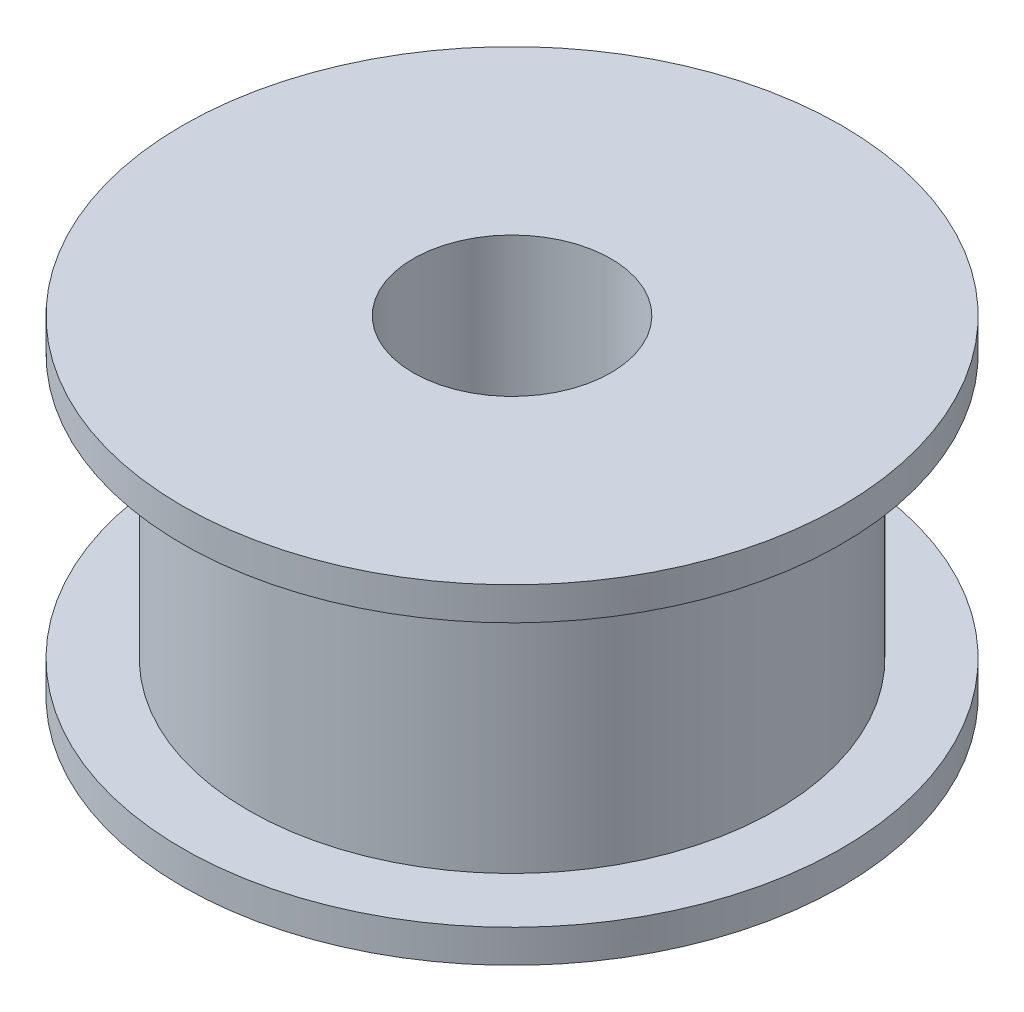
ISO-10303-21;
HEADER;
FILE_DESCRIPTION(('STEP AP214'),'2;1');
FILE_NAME('part.step','',(''),(''),'','','');
FILE_SCHEMA(('AUTOMOTIVE_DESIGN { 1 0 10303 214 1 1 1 1 }'));
ENDSEC;
DATA;
#1=APPLICATION_CONTEXT('core data for automotive mechanical design processes');
#2=APPLICATION_PROTOCOL_DEFINITION('international standard','automotive_design',2000,#1);
#3=PRODUCT_CONTEXT('',#1,'mechanical');
#4=PRODUCT('Part','Part','',(#3));
#5=PRODUCT_RELATED_PRODUCT_CATEGORY('part','',(#4));
#6=PRODUCT_DEFINITION_FORMATION('','',#4);
#7=PRODUCT_DEFINITION_CONTEXT('part definition',#1,'design');
#8=PRODUCT_DEFINITION('design','',#6,#7);
#9=PRODUCT_DEFINITION_SHAPE('','',#8);
#10=(LENGTH_UNIT() NAMED_UNIT(*) SI_UNIT(.MILLI.,.METRE.));
#11=(NAMED_UNIT(*) PLANE_ANGLE_UNIT() SI_UNIT($,.RADIAN.));
#12=(NAMED_UNIT(*) SI_UNIT($,.STERADIAN.) SOLID_ANGLE_UNIT());
#13=UNCERTAINTY_MEASURE_WITH_UNIT(LENGTH_MEASURE(1.E-05),#10,'distance_accuracy_value','');
#14=(GEOMETRIC_REPRESENTATION_CONTEXT(3) GLOBAL_UNCERTAINTY_ASSIGNED_CONTEXT((#13)) GLOBAL_UNIT_ASSIGNED_CONTEXT((#10,
#11,#12)) REPRESENTATION_CONTEXT('',''));
#15=CARTESIAN_POINT('',(0.,0.,0.));
#16=DIRECTION('',(0.,0.,1.));
#17=DIRECTION('',(1.,0.,0.));
#18=AXIS2_PLACEMENT_3D('',#15,#16,#17);
#19=CARTESIAN_POINT('',(0.,2.5,0.));
#20=DIRECTION('',(0.,-1.,0.));
#21=DIRECTION('',(0.,0.,-1.));
#22=AXIS2_PLACEMENT_3D('',#19,#20,#21);
#23=CYLINDRICAL_SURFACE('',#22,5.);
#24=CARTESIAN_POINT('',(0.,2.5,0.));
#25=DIRECTION('',(0.,1.,0.));
#26=DIRECTION('',(0.,0.,1.));
#27=AXIS2_PLACEMENT_3D('',#24,#25,#26);
#28=CIRCLE('',#27,5.);
#29=CARTESIAN_POINT('',(0.,2.5,5.));
#30=VERTEX_POINT('',#29);
#31=EDGE_CURVE('E10',#30,#30,#28,.T.);
#32=ORIENTED_EDGE('',*,*,#31,.F.);
#33=EDGE_LOOP('',(#32));
#34=FACE_BOUND('',#33,.T.);
#35=CARTESIAN_POINT('',(0.,2.,0.));
#36=DIRECTION('',(0.,-1.,0.));
#37=DIRECTION('',(0.,0.,-1.));
#38=AXIS2_PLACEMENT_3D('',#35,#36,#37);
#39=CIRCLE('',#38,5.);
#40=CARTESIAN_POINT('',(0.,2.,-5.));
#41=VERTEX_POINT('',#40);
#42=EDGE_CURVE('E56',#41,#41,#39,.T.);
#43=ORIENTED_EDGE('',*,*,#42,.F.);
#44=EDGE_LOOP('',(#43));
#45=FACE_BOUND('',#44,.T.);
#46=ADVANCED_FACE('F37',(#34,#45),#23,.T.);
#47=CARTESIAN_POINT('',(0.,2.5,0.));
#48=DIRECTION('',(0.,1.,0.));
#49=DIRECTION('',(0.,0.,1.));
#50=AXIS2_PLACEMENT_3D('',#47,#48,#49);
#51=PLANE('',#50);
#52=ORIENTED_EDGE('',*,*,#31,.T.);
#53=EDGE_LOOP('',(#52));
#54=FACE_BOUND('',#53,.T.);
#55=CARTESIAN_POINT('',(0.,2.5,0.));
#56=DIRECTION('',(0.,1.,0.));
#57=DIRECTION('',(0.,0.,1.));
#58=AXIS2_PLACEMENT_3D('',#55,#56,#57);
#59=CIRCLE('',#58,1.5);
#60=CARTESIAN_POINT('',(0.,2.5,1.5));
#61=VERTEX_POINT('',#60);
#62=EDGE_CURVE('E50',#61,#61,#59,.T.);
#63=ORIENTED_EDGE('',*,*,#62,.F.);
#64=EDGE_LOOP('',(#63));
#65=FACE_BOUND('',#64,.T.);
#66=ADVANCED_FACE('F96',(#54,#65),#51,.T.);
#67=CARTESIAN_POINT('',(0.,-2.5,0.));
#68=DIRECTION('',(0.,1.,0.));
#69=DIRECTION('',(0.,0.,1.));
#70=AXIS2_PLACEMENT_3D('',#67,#68,#69);
#71=PLANE('',#70);
#72=CARTESIAN_POINT('',(0.,-2.5,0.));
#73=DIRECTION('',(0.,1.,0.));
#74=DIRECTION('',(0.,0.,1.));
#75=AXIS2_PLACEMENT_3D('',#72,#73,#74);
#76=CIRCLE('',#75,5.);
#77=CARTESIAN_POINT('',(0.,-2.5,5.));
#78=VERTEX_POINT('',#77);
#79=EDGE_CURVE('E41',#78,#78,#76,.T.);
#80=ORIENTED_EDGE('',*,*,#79,.F.);
#81=EDGE_LOOP('',(#80));
#82=FACE_BOUND('',#81,.T.);
#83=CARTESIAN_POINT('',(0.,-2.5,0.));
#84=DIRECTION('',(0.,1.,0.));
#85=DIRECTION('',(0.,0.,1.));
#86=AXIS2_PLACEMENT_3D('',#83,#84,#85);
#87=CIRCLE('',#86,1.5);
#88=CARTESIAN_POINT('',(0.,-2.5,1.5));
#89=VERTEX_POINT('',#88);
#90=EDGE_CURVE('E52',#89,#89,#87,.T.);
#91=ORIENTED_EDGE('',*,*,#90,.T.);
#92=EDGE_LOOP('',(#91));
#93=FACE_BOUND('',#92,.T.);
#94=ADVANCED_FACE('F101',(#82,#93),#71,.F.);
#95=CARTESIAN_POINT('',(0.,-2.,0.));
#96=DIRECTION('',(0.,-1.,0.));
#97=DIRECTION('',(0.,0.,-1.));
#98=AXIS2_PLACEMENT_3D('',#95,#96,#97);
#99=CIRCLE('',#98,5.);
#100=CARTESIAN_POINT('',(0.,-2.,-5.));
#101=VERTEX_POINT('',#100);
#102=EDGE_CURVE('E63',#101,#101,#99,.T.);
#103=ORIENTED_EDGE('',*,*,#102,.T.);
#104=EDGE_LOOP('',(#103));
#105=FACE_BOUND('',#104,.T.);
#106=ORIENTED_EDGE('',*,*,#79,.T.);
#107=EDGE_LOOP('',(#106));
#108=FACE_BOUND('',#107,.T.);
#109=ADVANCED_FACE('F39',(#105,#108),#23,.T.);
#110=CARTESIAN_POINT('',(0.,2.5,0.));
#111=DIRECTION('',(0.,-1.,0.));
#112=DIRECTION('',(0.,0.,-1.));
#113=AXIS2_PLACEMENT_3D('',#110,#111,#112);
#114=CYLINDRICAL_SURFACE('',#113,1.5);
#115=ORIENTED_EDGE('',*,*,#62,.T.);
#116=EDGE_LOOP('',(#115));
#117=FACE_BOUND('',#116,.T.);
#118=ORIENTED_EDGE('',*,*,#90,.F.);
#119=EDGE_LOOP('',(#118));
#120=FACE_BOUND('',#119,.T.);
#121=ADVANCED_FACE('F83',(#117,#120),#114,.F.);
#122=CARTESIAN_POINT('',(0.,0.,0.));
#123=DIRECTION('',(0.,-1.,0.));
#124=DIRECTION('',(0.,0.,-1.));
#125=AXIS2_PLACEMENT_3D('',#122,#123,#124);
#126=CYLINDRICAL_SURFACE('',#125,4.);
#127=CARTESIAN_POINT('',(0.,-2.,0.));
#128=DIRECTION('',(0.,-1.,0.));
#129=DIRECTION('',(0.,0.,-1.));
#130=AXIS2_PLACEMENT_3D('',#127,#128,#129);
#131=CIRCLE('',#130,4.);
#132=CARTESIAN_POINT('',(0.,-2.,-4.));
#133=VERTEX_POINT('',#132);
#134=EDGE_CURVE('E67',#133,#133,#131,.T.);
#135=ORIENTED_EDGE('',*,*,#134,.F.);
#136=EDGE_LOOP('',(#135));
#137=FACE_BOUND('',#136,.T.);
#138=CARTESIAN_POINT('',(0.,2.,0.));
#139=DIRECTION('',(0.,-1.,0.));
#140=DIRECTION('',(0.,0.,-1.));
#141=AXIS2_PLACEMENT_3D('',#138,#139,#140);
#142=CIRCLE('',#141,4.);
#143=CARTESIAN_POINT('',(0.,2.,-4.));
#144=VERTEX_POINT('',#143);
#145=EDGE_CURVE('E71',#144,#144,#142,.T.);
#146=ORIENTED_EDGE('',*,*,#145,.T.);
#147=EDGE_LOOP('',(#146));
#148=FACE_BOUND('',#147,.T.);
#149=ADVANCED_FACE('F76',(#137,#148),#126,.T.);
#150=CARTESIAN_POINT('',(0.,2.,0.));
#151=DIRECTION('',(0.,-1.,0.));
#152=DIRECTION('',(0.,0.,-1.));
#153=AXIS2_PLACEMENT_3D('',#150,#151,#152);
#154=PLANE('',#153);
#155=ORIENTED_EDGE('',*,*,#42,.T.);
#156=EDGE_LOOP('',(#155));
#157=FACE_BOUND('',#156,.T.);
#158=ORIENTED_EDGE('',*,*,#145,.F.);
#159=EDGE_LOOP('',(#158));
#160=FACE_BOUND('',#159,.T.);
#161=ADVANCED_FACE('F78',(#157,#160),#154,.T.);
#162=CARTESIAN_POINT('',(0.,-2.,0.));
#163=DIRECTION('',(0.,-1.,0.));
#164=DIRECTION('',(0.,0.,-1.));
#165=AXIS2_PLACEMENT_3D('',#162,#163,#164);
#166=PLANE('',#165);
#167=ORIENTED_EDGE('',*,*,#102,.F.);
#168=EDGE_LOOP('',(#167));
#169=FACE_BOUND('',#168,.T.);
#170=ORIENTED_EDGE('',*,*,#134,.T.);
#171=EDGE_LOOP('',(#170));
#172=FACE_BOUND('',#171,.T.);
#173=ADVANCED_FACE('F80',(#169,#172),#166,.F.);
#174=CLOSED_SHELL('',(#46,#66,#94,#109,#121,#149,#161,#173));
#175=MANIFOLD_SOLID_BREP('B2',#174);
#176=ADVANCED_BREP_SHAPE_REPRESENTATION('',(#18,#175),#14);
#177=SHAPE_DEFINITION_REPRESENTATION(#9,#176);
ENDSEC;
END-ISO-10303-21;
